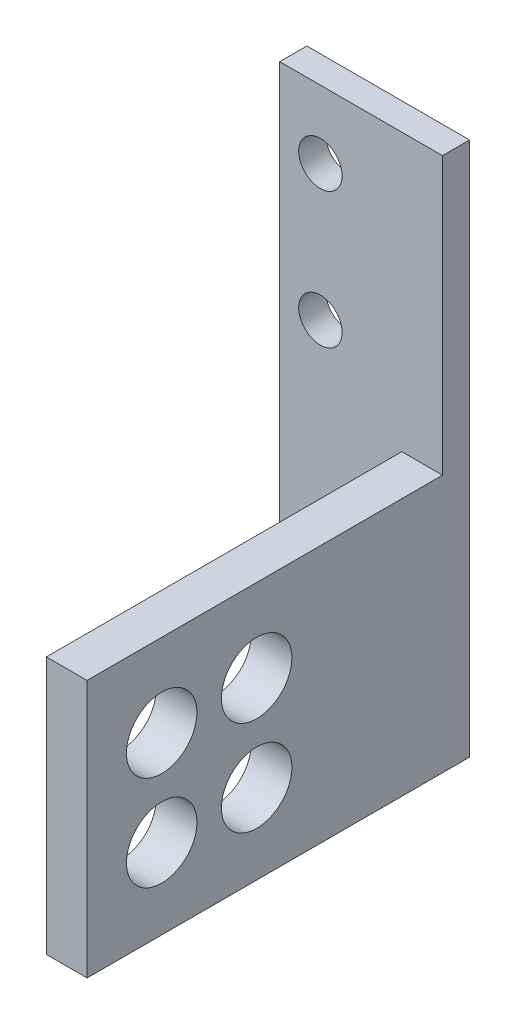
ISO-10303-21;
HEADER;
FILE_DESCRIPTION(('STEP AP214'),'2;1');
FILE_NAME('part.step','',(''),(''),'','','');
FILE_SCHEMA(('AUTOMOTIVE_DESIGN { 1 0 10303 214 1 1 1 1 }'));
ENDSEC;
DATA;
#1=APPLICATION_CONTEXT('core data for automotive mechanical design processes');
#2=APPLICATION_PROTOCOL_DEFINITION('international standard','automotive_design',2000,#1);
#3=PRODUCT_CONTEXT('',#1,'mechanical');
#4=PRODUCT('Part','Part','',(#3));
#5=PRODUCT_RELATED_PRODUCT_CATEGORY('part','',(#4));
#6=PRODUCT_DEFINITION_FORMATION('','',#4);
#7=PRODUCT_DEFINITION_CONTEXT('part definition',#1,'design');
#8=PRODUCT_DEFINITION('design','',#6,#7);
#9=PRODUCT_DEFINITION_SHAPE('','',#8);
#10=(LENGTH_UNIT() NAMED_UNIT(*) SI_UNIT(.MILLI.,.METRE.));
#11=(NAMED_UNIT(*) PLANE_ANGLE_UNIT() SI_UNIT($,.RADIAN.));
#12=(NAMED_UNIT(*) SI_UNIT($,.STERADIAN.) SOLID_ANGLE_UNIT());
#13=UNCERTAINTY_MEASURE_WITH_UNIT(LENGTH_MEASURE(1.E-05),#10,'distance_accuracy_value','');
#14=(GEOMETRIC_REPRESENTATION_CONTEXT(3) GLOBAL_UNCERTAINTY_ASSIGNED_CONTEXT((#13)) GLOBAL_UNIT_ASSIGNED_CONTEXT((#10,
#11,#12)) REPRESENTATION_CONTEXT('',''));
#15=CARTESIAN_POINT('',(0.,0.,0.));
#16=DIRECTION('',(0.,0.,1.));
#17=DIRECTION('',(1.,0.,0.));
#18=AXIS2_PLACEMENT_3D('',#15,#16,#17);
#19=CARTESIAN_POINT('',(-79.35,93.4,-2.));
#20=DIRECTION('',(1.,0.,0.));
#21=DIRECTION('',(0.,0.,-1.));
#22=AXIS2_PLACEMENT_3D('',#19,#20,#21);
#23=PLANE('',#22);
#24=DIRECTION('',(0.,-1.,0.));
#25=VECTOR('',#24,1.);
#26=CARTESIAN_POINT('',(-79.35,93.4,-4.));
#27=LINE('',#26,#25);
#28=CARTESIAN_POINT('',(-79.35,93.4,-4.));
#29=VERTEX_POINT('',#28);
#30=CARTESIAN_POINT('',(-79.35,54.,-4.));
#31=VERTEX_POINT('',#30);
#32=EDGE_CURVE('E122',#29,#31,#27,.T.);
#33=ORIENTED_EDGE('',*,*,#32,.T.);
#34=DIRECTION('',(0.,0.,-1.));
#35=VECTOR('',#34,1.);
#36=CARTESIAN_POINT('',(-79.35,54.,-2.));
#37=LINE('',#36,#35);
#38=CARTESIAN_POINT('',(-79.35,54.,-2.));
#39=VERTEX_POINT('',#38);
#40=EDGE_CURVE('E11',#39,#31,#37,.T.);
#41=ORIENTED_EDGE('',*,*,#40,.F.);
#42=DIRECTION('',(0.,-1.,0.));
#43=VECTOR('',#42,1.);
#44=CARTESIAN_POINT('',(-79.35,93.4,-2.));
#45=LINE('',#44,#43);
#46=CARTESIAN_POINT('',(-79.35,93.4,-2.));
#47=VERTEX_POINT('',#46);
#48=EDGE_CURVE('E131',#47,#39,#45,.T.);
#49=ORIENTED_EDGE('',*,*,#48,.F.);
#50=DIRECTION('',(0.,0.,-1.));
#51=VECTOR('',#50,1.);
#52=CARTESIAN_POINT('',(-79.35,93.4,-2.));
#53=LINE('',#52,#51);
#54=EDGE_CURVE('E139',#47,#29,#53,.T.);
#55=ORIENTED_EDGE('',*,*,#54,.T.);
#56=EDGE_LOOP('',(#33,#41,#49,#55));
#57=FACE_BOUND('',#56,.T.);
#58=ADVANCED_FACE('F41',(#57),#23,.F.);
#59=CARTESIAN_POINT('',(-79.35,54.,-2.));
#60=DIRECTION('',(0.,1.,0.));
#61=DIRECTION('',(0.,0.,1.));
#62=AXIS2_PLACEMENT_3D('',#59,#60,#61);
#63=PLANE('',#62);
#64=DIRECTION('',(1.,0.,0.));
#65=VECTOR('',#64,1.);
#66=CARTESIAN_POINT('',(-79.35,54.,-4.));
#67=LINE('',#66,#65);
#68=CARTESIAN_POINT('',(-67.35,54.,-4.));
#69=VERTEX_POINT('',#68);
#70=EDGE_CURVE('E123',#31,#69,#67,.T.);
#71=ORIENTED_EDGE('',*,*,#70,.T.);
#72=DIRECTION('',(0.,0.,-1.));
#73=VECTOR('',#72,1.);
#74=CARTESIAN_POINT('',(-67.35,54.,-2.));
#75=LINE('',#74,#73);
#76=CARTESIAN_POINT('',(-67.35,54.,24.2));
#77=VERTEX_POINT('',#76);
#78=EDGE_CURVE('E47',#77,#69,#75,.T.);
#79=ORIENTED_EDGE('',*,*,#78,.F.);
#80=DIRECTION('',(1.,0.,0.));
#81=VECTOR('',#80,1.);
#82=CARTESIAN_POINT('',(-70.35,54.,24.2));
#83=LINE('',#82,#81);
#84=CARTESIAN_POINT('',(-70.35,54.,24.2));
#85=VERTEX_POINT('',#84);
#86=EDGE_CURVE('E100',#85,#77,#83,.T.);
#87=ORIENTED_EDGE('',*,*,#86,.F.);
#88=DIRECTION('',(0.,0.,-1.));
#89=VECTOR('',#88,1.);
#90=CARTESIAN_POINT('',(-70.35,54.,24.2));
#91=LINE('',#90,#89);
#92=CARTESIAN_POINT('',(-70.35,54.,-2.));
#93=VERTEX_POINT('',#92);
#94=EDGE_CURVE('E101',#85,#93,#91,.T.);
#95=ORIENTED_EDGE('',*,*,#94,.T.);
#96=DIRECTION('',(1.,0.,0.));
#97=VECTOR('',#96,1.);
#98=CARTESIAN_POINT('',(-79.35,54.,-2.));
#99=LINE('',#98,#97);
#100=EDGE_CURVE('E64',#39,#93,#99,.T.);
#101=ORIENTED_EDGE('',*,*,#100,.F.);
#102=ORIENTED_EDGE('',*,*,#40,.T.);
#103=EDGE_LOOP('',(#71,#79,#87,#95,#101,#102));
#104=FACE_BOUND('',#103,.T.);
#105=ADVANCED_FACE('F103',(#104),#63,.F.);
#106=CARTESIAN_POINT('',(-67.35,54.,-2.));
#107=DIRECTION('',(-1.,0.,0.));
#108=DIRECTION('',(0.,0.,1.));
#109=AXIS2_PLACEMENT_3D('',#106,#107,#108);
#110=PLANE('',#109);
#111=CARTESIAN_POINT('',(-67.35,59.9,18.7));
#112=DIRECTION('',(1.,0.,0.));
#113=DIRECTION('',(0.,0.,-1.));
#114=AXIS2_PLACEMENT_3D('',#111,#112,#113);
#115=CIRCLE('',#114,2.6);
#116=CARTESIAN_POINT('',(-67.35,59.9,16.1));
#117=VERTEX_POINT('',#116);
#118=EDGE_CURVE('E165',#117,#117,#115,.T.);
#119=ORIENTED_EDGE('',*,*,#118,.F.);
#120=EDGE_LOOP('',(#119));
#121=FACE_BOUND('',#120,.T.);
#122=CARTESIAN_POINT('',(-67.35,66.9,11.7));
#123=DIRECTION('',(1.,0.,0.));
#124=DIRECTION('',(0.,0.,-1.));
#125=AXIS2_PLACEMENT_3D('',#122,#123,#124);
#126=CIRCLE('',#125,2.6);
#127=CARTESIAN_POINT('',(-67.35,66.9,9.1));
#128=VERTEX_POINT('',#127);
#129=EDGE_CURVE('E174',#128,#128,#126,.T.);
#130=ORIENTED_EDGE('',*,*,#129,.F.);
#131=EDGE_LOOP('',(#130));
#132=FACE_BOUND('',#131,.T.);
#133=CARTESIAN_POINT('',(-67.35,59.9,11.7));
#134=DIRECTION('',(1.,0.,0.));
#135=DIRECTION('',(0.,0.,-1.));
#136=AXIS2_PLACEMENT_3D('',#133,#134,#135);
#137=CIRCLE('',#136,2.6);
#138=CARTESIAN_POINT('',(-67.35,59.9,9.1));
#139=VERTEX_POINT('',#138);
#140=EDGE_CURVE('E169',#139,#139,#137,.T.);
#141=ORIENTED_EDGE('',*,*,#140,.F.);
#142=EDGE_LOOP('',(#141));
#143=FACE_BOUND('',#142,.T.);
#144=CARTESIAN_POINT('',(-67.35,66.9,18.7));
#145=DIRECTION('',(1.,0.,0.));
#146=DIRECTION('',(0.,0.,-1.));
#147=AXIS2_PLACEMENT_3D('',#144,#145,#146);
#148=CIRCLE('',#147,2.6);
#149=CARTESIAN_POINT('',(-67.35,66.9,16.1));
#150=VERTEX_POINT('',#149);
#151=EDGE_CURVE('E182',#150,#150,#148,.T.);
#152=ORIENTED_EDGE('',*,*,#151,.F.);
#153=EDGE_LOOP('',(#152));
#154=FACE_BOUND('',#153,.T.);
#155=DIRECTION('',(0.,1.,0.));
#156=VECTOR('',#155,1.);
#157=CARTESIAN_POINT('',(-67.35,54.,-4.));
#158=LINE('',#157,#156);
#159=CARTESIAN_POINT('',(-67.35,93.4,-4.));
#160=VERTEX_POINT('',#159);
#161=EDGE_CURVE('E145',#69,#160,#158,.T.);
#162=ORIENTED_EDGE('',*,*,#161,.T.);
#163=DIRECTION('',(0.,0.,-1.));
#164=VECTOR('',#163,1.);
#165=CARTESIAN_POINT('',(-67.35,93.4,-2.));
#166=LINE('',#165,#164);
#167=CARTESIAN_POINT('',(-67.35,93.4,-2.));
#168=VERTEX_POINT('',#167);
#169=EDGE_CURVE('E150',#168,#160,#166,.T.);
#170=ORIENTED_EDGE('',*,*,#169,.F.);
#171=DIRECTION('',(0.,1.,0.));
#172=VECTOR('',#171,1.);
#173=CARTESIAN_POINT('',(-67.35,54.,-2.));
#174=LINE('',#173,#172);
#175=CARTESIAN_POINT('',(-67.35,73.,-2.));
#176=VERTEX_POINT('',#175);
#177=EDGE_CURVE('E137',#176,#168,#174,.T.);
#178=ORIENTED_EDGE('',*,*,#177,.F.);
#179=DIRECTION('',(0.,0.,-1.));
#180=VECTOR('',#179,1.);
#181=CARTESIAN_POINT('',(-67.35,73.,24.2));
#182=LINE('',#181,#180);
#183=CARTESIAN_POINT('',(-67.35,73.,24.2));
#184=VERTEX_POINT('',#183);
#185=EDGE_CURVE('E125',#184,#176,#182,.T.);
#186=ORIENTED_EDGE('',*,*,#185,.F.);
#187=DIRECTION('',(0.,1.,0.));
#188=VECTOR('',#187,1.);
#189=CARTESIAN_POINT('',(-67.35,54.,24.2));
#190=LINE('',#189,#188);
#191=EDGE_CURVE('E108',#77,#184,#190,.T.);
#192=ORIENTED_EDGE('',*,*,#191,.F.);
#193=ORIENTED_EDGE('',*,*,#78,.T.);
#194=EDGE_LOOP('',(#162,#170,#178,#186,#192,#193));
#195=FACE_BOUND('',#194,.T.);
#196=ADVANCED_FACE('F193',(#121,#132,#143,#154,#195),#110,.F.);
#197=CARTESIAN_POINT('',(-67.35,93.4,-2.));
#198=DIRECTION('',(0.,-1.,0.));
#199=DIRECTION('',(0.,0.,-1.));
#200=AXIS2_PLACEMENT_3D('',#197,#198,#199);
#201=PLANE('',#200);
#202=DIRECTION('',(-1.,0.,0.));
#203=VECTOR('',#202,1.);
#204=CARTESIAN_POINT('',(-67.35,93.4,-4.));
#205=LINE('',#204,#203);
#206=EDGE_CURVE('E133',#160,#29,#205,.T.);
#207=ORIENTED_EDGE('',*,*,#206,.T.);
#208=ORIENTED_EDGE('',*,*,#54,.F.);
#209=DIRECTION('',(-1.,0.,0.));
#210=VECTOR('',#209,1.);
#211=CARTESIAN_POINT('',(-67.35,93.4,-2.));
#212=LINE('',#211,#210);
#213=EDGE_CURVE('E138',#168,#47,#212,.T.);
#214=ORIENTED_EDGE('',*,*,#213,.F.);
#215=ORIENTED_EDGE('',*,*,#169,.T.);
#216=EDGE_LOOP('',(#207,#208,#214,#215));
#217=FACE_BOUND('',#216,.T.);
#218=ADVANCED_FACE('F203',(#217),#201,.F.);
#219=CARTESIAN_POINT('',(0.,0.,-2.));
#220=DIRECTION('',(0.,0.,1.));
#221=DIRECTION('',(1.,0.,0.));
#222=AXIS2_PLACEMENT_3D('',#219,#220,#221);
#223=PLANE('',#222);
#224=CARTESIAN_POINT('',(-76.35,78.4,-2.));
#225=DIRECTION('',(0.,0.,1.));
#226=DIRECTION('',(1.,0.,0.));
#227=AXIS2_PLACEMENT_3D('',#224,#225,#226);
#228=CIRCLE('',#227,1.6);
#229=CARTESIAN_POINT('',(-74.75,78.4,-2.));
#230=VERTEX_POINT('',#229);
#231=EDGE_CURVE('E156',#230,#230,#228,.T.);
#232=ORIENTED_EDGE('',*,*,#231,.F.);
#233=EDGE_LOOP('',(#232));
#234=FACE_BOUND('',#233,.T.);
#235=CARTESIAN_POINT('',(-76.35,88.4,-2.));
#236=DIRECTION('',(0.,0.,1.));
#237=DIRECTION('',(1.,0.,0.));
#238=AXIS2_PLACEMENT_3D('',#235,#236,#237);
#239=CIRCLE('',#238,1.6);
#240=CARTESIAN_POINT('',(-74.75,88.4,-2.));
#241=VERTEX_POINT('',#240);
#242=EDGE_CURVE('E151',#241,#241,#239,.T.);
#243=ORIENTED_EDGE('',*,*,#242,.F.);
#244=EDGE_LOOP('',(#243));
#245=FACE_BOUND('',#244,.T.);
#246=DIRECTION('',(0.,-1.,0.));
#247=VECTOR('',#246,1.);
#248=CARTESIAN_POINT('',(-70.35,73.,-2.));
#249=LINE('',#248,#247);
#250=CARTESIAN_POINT('',(-70.35,73.,-2.));
#251=VERTEX_POINT('',#250);
#252=EDGE_CURVE('E119',#251,#93,#249,.T.);
#253=ORIENTED_EDGE('',*,*,#252,.F.);
#254=DIRECTION('',(-1.,0.,0.));
#255=VECTOR('',#254,1.);
#256=CARTESIAN_POINT('',(-67.35,73.,-2.));
#257=LINE('',#256,#255);
#258=EDGE_CURVE('E60',#176,#251,#257,.T.);
#259=ORIENTED_EDGE('',*,*,#258,.F.);
#260=ORIENTED_EDGE('',*,*,#177,.T.);
#261=ORIENTED_EDGE('',*,*,#213,.T.);
#262=ORIENTED_EDGE('',*,*,#48,.T.);
#263=ORIENTED_EDGE('',*,*,#100,.T.);
#264=EDGE_LOOP('',(#253,#259,#260,#261,#262,#263));
#265=FACE_BOUND('',#264,.T.);
#266=ADVANCED_FACE('F200',(#234,#245,#265),#223,.T.);
#267=CARTESIAN_POINT('',(0.,0.,-4.));
#268=DIRECTION('',(0.,0.,1.));
#269=DIRECTION('',(1.,0.,0.));
#270=AXIS2_PLACEMENT_3D('',#267,#268,#269);
#271=PLANE('',#270);
#272=CARTESIAN_POINT('',(-76.35,78.4,-4.));
#273=DIRECTION('',(0.,0.,1.));
#274=DIRECTION('',(1.,0.,0.));
#275=AXIS2_PLACEMENT_3D('',#272,#273,#274);
#276=CIRCLE('',#275,1.6);
#277=CARTESIAN_POINT('',(-74.75,78.4,-4.));
#278=VERTEX_POINT('',#277);
#279=EDGE_CURVE('E42',#278,#278,#276,.T.);
#280=ORIENTED_EDGE('',*,*,#279,.T.);
#281=EDGE_LOOP('',(#280));
#282=FACE_BOUND('',#281,.T.);
#283=CARTESIAN_POINT('',(-76.35,88.4,-4.));
#284=DIRECTION('',(0.,0.,1.));
#285=DIRECTION('',(1.,0.,0.));
#286=AXIS2_PLACEMENT_3D('',#283,#284,#285);
#287=CIRCLE('',#286,1.6);
#288=CARTESIAN_POINT('',(-74.75,88.4,-4.));
#289=VERTEX_POINT('',#288);
#290=EDGE_CURVE('E148',#289,#289,#287,.T.);
#291=ORIENTED_EDGE('',*,*,#290,.T.);
#292=EDGE_LOOP('',(#291));
#293=FACE_BOUND('',#292,.T.);
#294=ORIENTED_EDGE('',*,*,#32,.F.);
#295=ORIENTED_EDGE('',*,*,#206,.F.);
#296=ORIENTED_EDGE('',*,*,#161,.F.);
#297=ORIENTED_EDGE('',*,*,#70,.F.);
#298=EDGE_LOOP('',(#294,#295,#296,#297));
#299=FACE_BOUND('',#298,.T.);
#300=ADVANCED_FACE('F209',(#282,#293,#299),#271,.F.);
#301=CARTESIAN_POINT('',(-70.35,73.,24.2));
#302=DIRECTION('',(1.,0.,0.));
#303=DIRECTION('',(0.,0.,-1.));
#304=AXIS2_PLACEMENT_3D('',#301,#302,#303);
#305=PLANE('',#304);
#306=CARTESIAN_POINT('',(-70.35,59.9,18.7));
#307=DIRECTION('',(1.,0.,0.));
#308=DIRECTION('',(0.,0.,-1.));
#309=AXIS2_PLACEMENT_3D('',#306,#307,#308);
#310=CIRCLE('',#309,2.6);
#311=CARTESIAN_POINT('',(-70.35,59.9,16.1));
#312=VERTEX_POINT('',#311);
#313=EDGE_CURVE('E178',#312,#312,#310,.T.);
#314=ORIENTED_EDGE('',*,*,#313,.T.);
#315=EDGE_LOOP('',(#314));
#316=FACE_BOUND('',#315,.T.);
#317=CARTESIAN_POINT('',(-70.35,66.9,11.7));
#318=DIRECTION('',(1.,0.,0.));
#319=DIRECTION('',(0.,0.,-1.));
#320=AXIS2_PLACEMENT_3D('',#317,#318,#319);
#321=CIRCLE('',#320,2.6);
#322=CARTESIAN_POINT('',(-70.35,66.9,9.1));
#323=VERTEX_POINT('',#322);
#324=EDGE_CURVE('E175',#323,#323,#321,.T.);
#325=ORIENTED_EDGE('',*,*,#324,.T.);
#326=EDGE_LOOP('',(#325));
#327=FACE_BOUND('',#326,.T.);
#328=CARTESIAN_POINT('',(-70.35,59.9,11.7));
#329=DIRECTION('',(1.,0.,0.));
#330=DIRECTION('',(0.,0.,-1.));
#331=AXIS2_PLACEMENT_3D('',#328,#329,#330);
#332=CIRCLE('',#331,2.6);
#333=CARTESIAN_POINT('',(-70.35,59.9,9.1));
#334=VERTEX_POINT('',#333);
#335=EDGE_CURVE('E164',#334,#334,#332,.T.);
#336=ORIENTED_EDGE('',*,*,#335,.T.);
#337=EDGE_LOOP('',(#336));
#338=FACE_BOUND('',#337,.T.);
#339=CARTESIAN_POINT('',(-70.35,66.9,18.7));
#340=DIRECTION('',(1.,0.,0.));
#341=DIRECTION('',(0.,0.,-1.));
#342=AXIS2_PLACEMENT_3D('',#339,#340,#341);
#343=CIRCLE('',#342,2.6);
#344=CARTESIAN_POINT('',(-70.35,66.9,16.1));
#345=VERTEX_POINT('',#344);
#346=EDGE_CURVE('E166',#345,#345,#343,.T.);
#347=ORIENTED_EDGE('',*,*,#346,.T.);
#348=EDGE_LOOP('',(#347));
#349=FACE_BOUND('',#348,.T.);
#350=ORIENTED_EDGE('',*,*,#252,.T.);
#351=ORIENTED_EDGE('',*,*,#94,.F.);
#352=DIRECTION('',(0.,-1.,0.));
#353=VECTOR('',#352,1.);
#354=CARTESIAN_POINT('',(-70.35,73.,24.2));
#355=LINE('',#354,#353);
#356=CARTESIAN_POINT('',(-70.35,73.,24.2));
#357=VERTEX_POINT('',#356);
#358=EDGE_CURVE('E107',#357,#85,#355,.T.);
#359=ORIENTED_EDGE('',*,*,#358,.F.);
#360=DIRECTION('',(0.,0.,-1.));
#361=VECTOR('',#360,1.);
#362=CARTESIAN_POINT('',(-70.35,73.,24.2));
#363=LINE('',#362,#361);
#364=EDGE_CURVE('E129',#357,#251,#363,.T.);
#365=ORIENTED_EDGE('',*,*,#364,.T.);
#366=EDGE_LOOP('',(#350,#351,#359,#365));
#367=FACE_BOUND('',#366,.T.);
#368=ADVANCED_FACE('F118',(#316,#327,#338,#349,#367),#305,.F.);
#369=CARTESIAN_POINT('',(-67.35,73.,24.2));
#370=DIRECTION('',(0.,-1.,0.));
#371=DIRECTION('',(0.,0.,-1.));
#372=AXIS2_PLACEMENT_3D('',#369,#370,#371);
#373=PLANE('',#372);
#374=ORIENTED_EDGE('',*,*,#258,.T.);
#375=ORIENTED_EDGE('',*,*,#364,.F.);
#376=DIRECTION('',(-1.,0.,0.));
#377=VECTOR('',#376,1.);
#378=CARTESIAN_POINT('',(-67.35,73.,24.2));
#379=LINE('',#378,#377);
#380=EDGE_CURVE('E112',#184,#357,#379,.T.);
#381=ORIENTED_EDGE('',*,*,#380,.F.);
#382=ORIENTED_EDGE('',*,*,#185,.T.);
#383=EDGE_LOOP('',(#374,#375,#381,#382));
#384=FACE_BOUND('',#383,.T.);
#385=ADVANCED_FACE('F195',(#384),#373,.F.);
#386=CARTESIAN_POINT('',(0.,0.,24.2));
#387=DIRECTION('',(0.,0.,1.));
#388=DIRECTION('',(1.,0.,0.));
#389=AXIS2_PLACEMENT_3D('',#386,#387,#388);
#390=PLANE('',#389);
#391=ORIENTED_EDGE('',*,*,#358,.T.);
#392=ORIENTED_EDGE('',*,*,#86,.T.);
#393=ORIENTED_EDGE('',*,*,#191,.T.);
#394=ORIENTED_EDGE('',*,*,#380,.T.);
#395=EDGE_LOOP('',(#391,#392,#393,#394));
#396=FACE_BOUND('',#395,.T.);
#397=ADVANCED_FACE('F115',(#396),#390,.T.);
#398=CARTESIAN_POINT('',(-67.35,66.9,18.7));
#399=DIRECTION('',(-1.,0.,0.));
#400=DIRECTION('',(0.,0.,1.));
#401=AXIS2_PLACEMENT_3D('',#398,#399,#400);
#402=CYLINDRICAL_SURFACE('',#401,2.6);
#403=ORIENTED_EDGE('',*,*,#151,.T.);
#404=EDGE_LOOP('',(#403));
#405=FACE_BOUND('',#404,.T.);
#406=ORIENTED_EDGE('',*,*,#346,.F.);
#407=EDGE_LOOP('',(#406));
#408=FACE_BOUND('',#407,.T.);
#409=ADVANCED_FACE('F282',(#405,#408),#402,.F.);
#410=CARTESIAN_POINT('',(-67.35,59.9,11.7));
#411=DIRECTION('',(-1.,0.,0.));
#412=DIRECTION('',(0.,0.,1.));
#413=AXIS2_PLACEMENT_3D('',#410,#411,#412);
#414=CYLINDRICAL_SURFACE('',#413,2.6);
#415=ORIENTED_EDGE('',*,*,#140,.T.);
#416=EDGE_LOOP('',(#415));
#417=FACE_BOUND('',#416,.T.);
#418=ORIENTED_EDGE('',*,*,#335,.F.);
#419=EDGE_LOOP('',(#418));
#420=FACE_BOUND('',#419,.T.);
#421=ADVANCED_FACE('F291',(#417,#420),#414,.F.);
#422=CARTESIAN_POINT('',(-67.35,66.9,11.7));
#423=DIRECTION('',(-1.,0.,0.));
#424=DIRECTION('',(0.,0.,1.));
#425=AXIS2_PLACEMENT_3D('',#422,#423,#424);
#426=CYLINDRICAL_SURFACE('',#425,2.6);
#427=ORIENTED_EDGE('',*,*,#129,.T.);
#428=EDGE_LOOP('',(#427));
#429=FACE_BOUND('',#428,.T.);
#430=ORIENTED_EDGE('',*,*,#324,.F.);
#431=EDGE_LOOP('',(#430));
#432=FACE_BOUND('',#431,.T.);
#433=ADVANCED_FACE('F303',(#429,#432),#426,.F.);
#434=CARTESIAN_POINT('',(-67.35,59.9,18.7));
#435=DIRECTION('',(-1.,0.,0.));
#436=DIRECTION('',(0.,0.,1.));
#437=AXIS2_PLACEMENT_3D('',#434,#435,#436);
#438=CYLINDRICAL_SURFACE('',#437,2.6);
#439=ORIENTED_EDGE('',*,*,#118,.T.);
#440=EDGE_LOOP('',(#439));
#441=FACE_BOUND('',#440,.T.);
#442=ORIENTED_EDGE('',*,*,#313,.F.);
#443=EDGE_LOOP('',(#442));
#444=FACE_BOUND('',#443,.T.);
#445=ADVANCED_FACE('F312',(#441,#444),#438,.F.);
#446=CARTESIAN_POINT('',(-76.35,88.4,-15.));
#447=DIRECTION('',(0.,0.,1.));
#448=DIRECTION('',(1.,0.,0.));
#449=AXIS2_PLACEMENT_3D('',#446,#447,#448);
#450=CYLINDRICAL_SURFACE('',#449,1.6);
#451=ORIENTED_EDGE('',*,*,#242,.T.);
#452=EDGE_LOOP('',(#451));
#453=FACE_BOUND('',#452,.T.);
#454=ORIENTED_EDGE('',*,*,#290,.F.);
#455=EDGE_LOOP('',(#454));
#456=FACE_BOUND('',#455,.T.);
#457=ADVANCED_FACE('F325',(#453,#456),#450,.F.);
#458=CARTESIAN_POINT('',(-76.35,78.4,-15.));
#459=DIRECTION('',(0.,0.,1.));
#460=DIRECTION('',(1.,0.,0.));
#461=AXIS2_PLACEMENT_3D('',#458,#459,#460);
#462=CYLINDRICAL_SURFACE('',#461,1.6);
#463=ORIENTED_EDGE('',*,*,#231,.T.);
#464=EDGE_LOOP('',(#463));
#465=FACE_BOUND('',#464,.T.);
#466=ORIENTED_EDGE('',*,*,#279,.F.);
#467=EDGE_LOOP('',(#466));
#468=FACE_BOUND('',#467,.T.);
#469=ADVANCED_FACE('F332',(#465,#468),#462,.F.);
#470=CLOSED_SHELL('',(#58,#105,#196,#218,#266,#300,#368,#385,#397,#409,#421,#433,#445,#457,#469));
#471=MANIFOLD_SOLID_BREP('B2',#470);
#472=ADVANCED_BREP_SHAPE_REPRESENTATION('',(#18,#471),#14);
#473=SHAPE_DEFINITION_REPRESENTATION(#9,#472);
ENDSEC;
END-ISO-10303-21;
